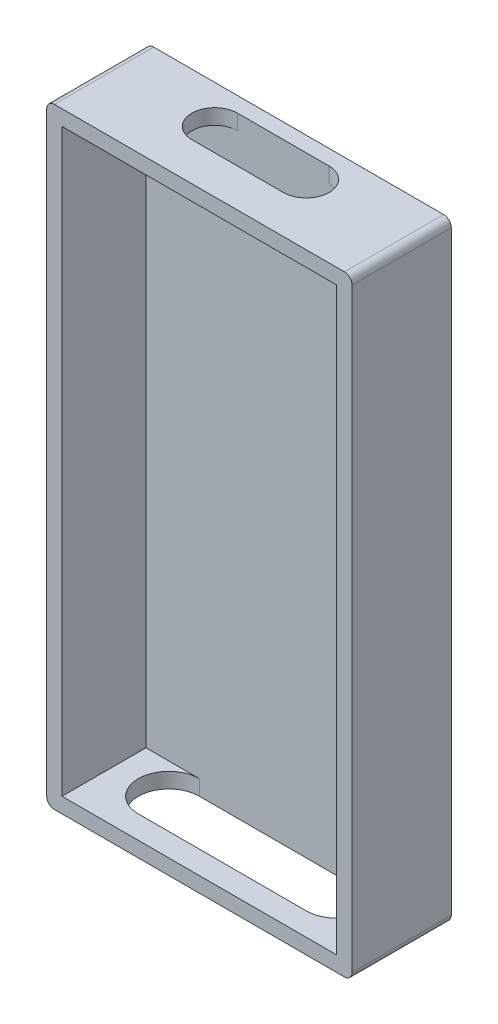
ISO-10303-21;
HEADER;
FILE_DESCRIPTION(('STEP AP214'),'2;1');
FILE_NAME('part.step','',(''),(''),'','','');
FILE_SCHEMA(('AUTOMOTIVE_DESIGN { 1 0 10303 214 1 1 1 1 }'));
ENDSEC;
DATA;
#1=APPLICATION_CONTEXT('core data for automotive mechanical design processes');
#2=APPLICATION_PROTOCOL_DEFINITION('international standard','automotive_design',2000,#1);
#3=PRODUCT_CONTEXT('',#1,'mechanical');
#4=PRODUCT('Part','Part','',(#3));
#5=PRODUCT_RELATED_PRODUCT_CATEGORY('part','',(#4));
#6=PRODUCT_DEFINITION_FORMATION('','',#4);
#7=PRODUCT_DEFINITION_CONTEXT('part definition',#1,'design');
#8=PRODUCT_DEFINITION('design','',#6,#7);
#9=PRODUCT_DEFINITION_SHAPE('','',#8);
#10=(LENGTH_UNIT() NAMED_UNIT(*) SI_UNIT(.MILLI.,.METRE.));
#11=(NAMED_UNIT(*) PLANE_ANGLE_UNIT() SI_UNIT($,.RADIAN.));
#12=(NAMED_UNIT(*) SI_UNIT($,.STERADIAN.) SOLID_ANGLE_UNIT());
#13=UNCERTAINTY_MEASURE_WITH_UNIT(LENGTH_MEASURE(1.E-05),#10,'distance_accuracy_value','');
#14=(GEOMETRIC_REPRESENTATION_CONTEXT(3) GLOBAL_UNCERTAINTY_ASSIGNED_CONTEXT((#13)) GLOBAL_UNIT_ASSIGNED_CONTEXT((#10,
#11,#12)) REPRESENTATION_CONTEXT('',''));
#15=CARTESIAN_POINT('',(0.,0.,0.));
#16=DIRECTION('',(0.,0.,1.));
#17=DIRECTION('',(1.,0.,0.));
#18=AXIS2_PLACEMENT_3D('',#15,#16,#17);
#19=CARTESIAN_POINT('',(10.,-20.,6.5));
#20=DIRECTION('',(-1.,0.,0.));
#21=DIRECTION('',(0.,0.,1.));
#22=AXIS2_PLACEMENT_3D('',#19,#20,#21);
#23=PLANE('',#22);
#24=DIRECTION('',(0.,1.,0.));
#25=VECTOR('',#24,1.);
#26=CARTESIAN_POINT('',(10.,-20.,0.));
#27=LINE('',#26,#25);
#28=CARTESIAN_POINT('',(10.,-19.5,0.));
#29=VERTEX_POINT('',#28);
#30=CARTESIAN_POINT('',(10.,19.5,0.));
#31=VERTEX_POINT('',#30);
#32=EDGE_CURVE('E279',#29,#31,#27,.T.);
#33=ORIENTED_EDGE('',*,*,#32,.T.);
#34=DIRECTION('',(0.,0.,-1.));
#35=VECTOR('',#34,1.);
#36=CARTESIAN_POINT('',(10.,19.5,6.5));
#37=LINE('',#36,#35);
#38=CARTESIAN_POINT('',(10.,19.5,6.5));
#39=VERTEX_POINT('',#38);
#40=EDGE_CURVE('E316',#31,#39,#37,.F.);
#41=ORIENTED_EDGE('',*,*,#40,.T.);
#42=DIRECTION('',(0.,1.,0.));
#43=VECTOR('',#42,1.);
#44=CARTESIAN_POINT('',(10.,-20.,6.5));
#45=LINE('',#44,#43);
#46=CARTESIAN_POINT('',(10.,-19.5,6.5));
#47=VERTEX_POINT('',#46);
#48=EDGE_CURVE('E280',#47,#39,#45,.T.);
#49=ORIENTED_EDGE('',*,*,#48,.F.);
#50=DIRECTION('',(0.,0.,-1.));
#51=VECTOR('',#50,1.);
#52=CARTESIAN_POINT('',(10.,-19.5,6.5));
#53=LINE('',#52,#51);
#54=EDGE_CURVE('E313',#47,#29,#53,.T.);
#55=ORIENTED_EDGE('',*,*,#54,.T.);
#56=EDGE_LOOP('',(#33,#41,#49,#55));
#57=FACE_BOUND('',#56,.T.);
#58=ADVANCED_FACE('F43',(#57),#23,.F.);
#59=CARTESIAN_POINT('',(-10.,20.,6.5));
#60=DIRECTION('',(0.,-1.,0.));
#61=DIRECTION('',(0.,0.,-1.));
#62=AXIS2_PLACEMENT_3D('',#59,#60,#61);
#63=PLANE('',#62);
#64=DIRECTION('',(1.,0.,0.));
#65=VECTOR('',#64,1.);
#66=CARTESIAN_POINT('',(-3.,20.,4.));
#67=LINE('',#66,#65);
#68=CARTESIAN_POINT('',(-3.,20.,4.));
#69=VERTEX_POINT('',#68);
#70=CARTESIAN_POINT('',(3.,20.,4.));
#71=VERTEX_POINT('',#70);
#72=EDGE_CURVE('E196',#69,#71,#67,.T.);
#73=ORIENTED_EDGE('',*,*,#72,.F.);
#74=CARTESIAN_POINT('',(-3.,20.,2.5));
#75=DIRECTION('',(0.,1.,0.));
#76=DIRECTION('',(0.,0.,1.));
#77=AXIS2_PLACEMENT_3D('',#74,#75,#76);
#78=CIRCLE('',#77,1.5);
#79=CARTESIAN_POINT('',(-3.,20.,0.999999999999998));
#80=VERTEX_POINT('',#79);
#81=EDGE_CURVE('E201',#80,#69,#78,.T.);
#82=ORIENTED_EDGE('',*,*,#81,.F.);
#83=DIRECTION('',(-1.,0.,0.));
#84=VECTOR('',#83,1.);
#85=CARTESIAN_POINT('',(-3.,20.,0.999999999999998));
#86=LINE('',#85,#84);
#87=CARTESIAN_POINT('',(3.,20.,0.999999999999997));
#88=VERTEX_POINT('',#87);
#89=EDGE_CURVE('E206',#88,#80,#86,.T.);
#90=ORIENTED_EDGE('',*,*,#89,.F.);
#91=CARTESIAN_POINT('',(3.,20.,2.5));
#92=DIRECTION('',(0.,1.,0.));
#93=DIRECTION('',(0.,0.,1.));
#94=AXIS2_PLACEMENT_3D('',#91,#92,#93);
#95=CIRCLE('',#94,1.5);
#96=EDGE_CURVE('E185',#71,#88,#95,.T.);
#97=ORIENTED_EDGE('',*,*,#96,.F.);
#98=EDGE_LOOP('',(#73,#82,#90,#97));
#99=FACE_BOUND('',#98,.T.);
#100=DIRECTION('',(-1.,0.,0.));
#101=VECTOR('',#100,1.);
#102=CARTESIAN_POINT('',(-10.,20.,6.5));
#103=LINE('',#102,#101);
#104=CARTESIAN_POINT('',(9.5,20.,6.5));
#105=VERTEX_POINT('',#104);
#106=CARTESIAN_POINT('',(-9.5,20.,6.5));
#107=VERTEX_POINT('',#106);
#108=EDGE_CURVE('E283',#105,#107,#103,.T.);
#109=ORIENTED_EDGE('',*,*,#108,.F.);
#110=DIRECTION('',(0.,0.,-1.));
#111=VECTOR('',#110,1.);
#112=CARTESIAN_POINT('',(9.5,20.,6.5));
#113=LINE('',#112,#111);
#114=CARTESIAN_POINT('',(9.5,20.,0.));
#115=VERTEX_POINT('',#114);
#116=EDGE_CURVE('E302',#105,#115,#113,.T.);
#117=ORIENTED_EDGE('',*,*,#116,.T.);
#118=DIRECTION('',(-1.,0.,0.));
#119=VECTOR('',#118,1.);
#120=CARTESIAN_POINT('',(-10.,20.,0.));
#121=LINE('',#120,#119);
#122=CARTESIAN_POINT('',(-9.5,20.,0.));
#123=VERTEX_POINT('',#122);
#124=EDGE_CURVE('E294',#115,#123,#121,.T.);
#125=ORIENTED_EDGE('',*,*,#124,.T.);
#126=DIRECTION('',(0.,0.,-1.));
#127=VECTOR('',#126,1.);
#128=CARTESIAN_POINT('',(-9.5,20.,6.5));
#129=LINE('',#128,#127);
#130=EDGE_CURVE('E291',#123,#107,#129,.F.);
#131=ORIENTED_EDGE('',*,*,#130,.T.);
#132=EDGE_LOOP('',(#109,#117,#125,#131));
#133=FACE_BOUND('',#132,.T.);
#134=ADVANCED_FACE('F203',(#99,#133),#63,.F.);
#135=CARTESIAN_POINT('',(-10.,-20.,6.5));
#136=DIRECTION('',(1.,0.,0.));
#137=DIRECTION('',(0.,0.,-1.));
#138=AXIS2_PLACEMENT_3D('',#135,#136,#137);
#139=PLANE('',#138);
#140=DIRECTION('',(0.,-1.,0.));
#141=VECTOR('',#140,1.);
#142=CARTESIAN_POINT('',(-10.,-20.,6.5));
#143=LINE('',#142,#141);
#144=CARTESIAN_POINT('',(-10.,19.5,6.5));
#145=VERTEX_POINT('',#144);
#146=CARTESIAN_POINT('',(-10.,-19.5,6.5));
#147=VERTEX_POINT('',#146);
#148=EDGE_CURVE('E287',#145,#147,#143,.T.);
#149=ORIENTED_EDGE('',*,*,#148,.F.);
#150=DIRECTION('',(0.,0.,-1.));
#151=VECTOR('',#150,1.);
#152=CARTESIAN_POINT('',(-10.,19.5,6.5));
#153=LINE('',#152,#151);
#154=CARTESIAN_POINT('',(-10.,19.5,0.));
#155=VERTEX_POINT('',#154);
#156=EDGE_CURVE('E327',#145,#155,#153,.T.);
#157=ORIENTED_EDGE('',*,*,#156,.T.);
#158=DIRECTION('',(0.,-1.,0.));
#159=VECTOR('',#158,1.);
#160=CARTESIAN_POINT('',(-10.,-20.,0.));
#161=LINE('',#160,#159);
#162=CARTESIAN_POINT('',(-10.,-19.5,0.));
#163=VERTEX_POINT('',#162);
#164=EDGE_CURVE('E297',#155,#163,#161,.T.);
#165=ORIENTED_EDGE('',*,*,#164,.T.);
#166=DIRECTION('',(0.,0.,-1.));
#167=VECTOR('',#166,1.);
#168=CARTESIAN_POINT('',(-10.,-19.5,6.5));
#169=LINE('',#168,#167);
#170=EDGE_CURVE('E325',#163,#147,#169,.F.);
#171=ORIENTED_EDGE('',*,*,#170,.T.);
#172=EDGE_LOOP('',(#149,#157,#165,#171));
#173=FACE_BOUND('',#172,.T.);
#174=ADVANCED_FACE('F333',(#173),#139,.F.);
#175=CARTESIAN_POINT('',(-10.,-20.,6.5));
#176=DIRECTION('',(0.,1.,0.));
#177=DIRECTION('',(0.,0.,1.));
#178=AXIS2_PLACEMENT_3D('',#175,#176,#177);
#179=PLANE('',#178);
#180=DIRECTION('',(1.,0.,0.));
#181=VECTOR('',#180,1.);
#182=CARTESIAN_POINT('',(-5.5,-20.,0.999999999999999));
#183=LINE('',#182,#181);
#184=CARTESIAN_POINT('',(-5.5,-20.,0.999999999999999));
#185=VERTEX_POINT('',#184);
#186=CARTESIAN_POINT('',(5.5,-20.,1.));
#187=VERTEX_POINT('',#186);
#188=EDGE_CURVE('E229',#185,#187,#183,.T.);
#189=ORIENTED_EDGE('',*,*,#188,.F.);
#190=CARTESIAN_POINT('',(-5.5,-20.,3.));
#191=DIRECTION('',(0.,-1.,0.));
#192=DIRECTION('',(0.,0.,-1.));
#193=AXIS2_PLACEMENT_3D('',#190,#191,#192);
#194=CIRCLE('',#193,2.);
#195=CARTESIAN_POINT('',(-5.5,-20.,5.));
#196=VERTEX_POINT('',#195);
#197=EDGE_CURVE('E217',#196,#185,#194,.T.);
#198=ORIENTED_EDGE('',*,*,#197,.F.);
#199=DIRECTION('',(-1.,0.,0.));
#200=VECTOR('',#199,1.);
#201=CARTESIAN_POINT('',(-5.5,-20.,5.));
#202=LINE('',#201,#200);
#203=CARTESIAN_POINT('',(5.5,-20.,5.));
#204=VERTEX_POINT('',#203);
#205=EDGE_CURVE('E235',#204,#196,#202,.T.);
#206=ORIENTED_EDGE('',*,*,#205,.F.);
#207=CARTESIAN_POINT('',(5.5,-20.,3.));
#208=DIRECTION('',(0.,-1.,0.));
#209=DIRECTION('',(0.,0.,-1.));
#210=AXIS2_PLACEMENT_3D('',#207,#208,#209);
#211=CIRCLE('',#210,2.);
#212=EDGE_CURVE('E232',#187,#204,#211,.T.);
#213=ORIENTED_EDGE('',*,*,#212,.F.);
#214=EDGE_LOOP('',(#189,#198,#206,#213));
#215=FACE_BOUND('',#214,.T.);
#216=DIRECTION('',(1.,0.,0.));
#217=VECTOR('',#216,1.);
#218=CARTESIAN_POINT('',(-10.,-20.,6.5));
#219=LINE('',#218,#217);
#220=CARTESIAN_POINT('',(-9.5,-20.,6.5));
#221=VERTEX_POINT('',#220);
#222=CARTESIAN_POINT('',(9.5,-20.,6.5));
#223=VERTEX_POINT('',#222);
#224=EDGE_CURVE('E289',#221,#223,#219,.T.);
#225=ORIENTED_EDGE('',*,*,#224,.F.);
#226=DIRECTION('',(0.,0.,-1.));
#227=VECTOR('',#226,1.);
#228=CARTESIAN_POINT('',(-9.5,-20.,6.5));
#229=LINE('',#228,#227);
#230=CARTESIAN_POINT('',(-9.5,-20.,0.));
#231=VERTEX_POINT('',#230);
#232=EDGE_CURVE('E12',#221,#231,#229,.T.);
#233=ORIENTED_EDGE('',*,*,#232,.T.);
#234=DIRECTION('',(1.,0.,0.));
#235=VECTOR('',#234,1.);
#236=CARTESIAN_POINT('',(-10.,-20.,0.));
#237=LINE('',#236,#235);
#238=CARTESIAN_POINT('',(9.5,-20.,0.));
#239=VERTEX_POINT('',#238);
#240=EDGE_CURVE('E284',#231,#239,#237,.T.);
#241=ORIENTED_EDGE('',*,*,#240,.T.);
#242=DIRECTION('',(0.,0.,-1.));
#243=VECTOR('',#242,1.);
#244=CARTESIAN_POINT('',(9.5,-20.,6.5));
#245=LINE('',#244,#243);
#246=EDGE_CURVE('E51',#239,#223,#245,.F.);
#247=ORIENTED_EDGE('',*,*,#246,.T.);
#248=EDGE_LOOP('',(#225,#233,#241,#247));
#249=FACE_BOUND('',#248,.T.);
#250=ADVANCED_FACE('F344',(#215,#249),#179,.F.);
#251=CARTESIAN_POINT('',(0.,0.,6.5));
#252=DIRECTION('',(0.,0.,-1.));
#253=DIRECTION('',(-1.,0.,0.));
#254=AXIS2_PLACEMENT_3D('',#251,#252,#253);
#255=PLANE('',#254);
#256=DIRECTION('',(0.,1.,0.));
#257=VECTOR('',#256,1.);
#258=CARTESIAN_POINT('',(8.99711468655567,19.,6.5));
#259=LINE('',#258,#257);
#260=CARTESIAN_POINT('',(8.99711468655568,-19.,6.5));
#261=VERTEX_POINT('',#260);
#262=CARTESIAN_POINT('',(8.99711468655567,19.,6.5));
#263=VERTEX_POINT('',#262);
#264=EDGE_CURVE('E249',#261,#263,#259,.T.);
#265=ORIENTED_EDGE('',*,*,#264,.F.);
#266=DIRECTION('',(1.,0.,0.));
#267=VECTOR('',#266,1.);
#268=CARTESIAN_POINT('',(-8.99999999999999,-19.,6.5));
#269=LINE('',#268,#267);
#270=CARTESIAN_POINT('',(-8.99999999999999,-19.,6.5));
#271=VERTEX_POINT('',#270);
#272=EDGE_CURVE('E252',#271,#261,#269,.T.);
#273=ORIENTED_EDGE('',*,*,#272,.F.);
#274=DIRECTION('',(0.,-1.,0.));
#275=VECTOR('',#274,1.);
#276=CARTESIAN_POINT('',(-9.,19.,6.5));
#277=LINE('',#276,#275);
#278=CARTESIAN_POINT('',(-9.,19.,6.5));
#279=VERTEX_POINT('',#278);
#280=EDGE_CURVE('E227',#279,#271,#277,.T.);
#281=ORIENTED_EDGE('',*,*,#280,.F.);
#282=DIRECTION('',(-1.,0.,0.));
#283=VECTOR('',#282,1.);
#284=CARTESIAN_POINT('',(-9.,19.,6.5));
#285=LINE('',#284,#283);
#286=EDGE_CURVE('E246',#263,#279,#285,.T.);
#287=ORIENTED_EDGE('',*,*,#286,.F.);
#288=EDGE_LOOP('',(#265,#273,#281,#287));
#289=FACE_BOUND('',#288,.T.);
#290=ORIENTED_EDGE('',*,*,#48,.T.);
#291=CARTESIAN_POINT('',(9.5,19.5,6.5));
#292=DIRECTION('',(0.,0.,-1.));
#293=DIRECTION('',(-1.,0.,0.));
#294=AXIS2_PLACEMENT_3D('',#291,#292,#293);
#295=CIRCLE('',#294,0.5);
#296=EDGE_CURVE('E323',#39,#105,#295,.F.);
#297=ORIENTED_EDGE('',*,*,#296,.T.);
#298=ORIENTED_EDGE('',*,*,#108,.T.);
#299=CARTESIAN_POINT('',(-9.5,19.5,6.5));
#300=DIRECTION('',(0.,0.,-1.));
#301=DIRECTION('',(-1.,0.,0.));
#302=AXIS2_PLACEMENT_3D('',#299,#300,#301);
#303=CIRCLE('',#302,0.5);
#304=EDGE_CURVE('E321',#107,#145,#303,.F.);
#305=ORIENTED_EDGE('',*,*,#304,.T.);
#306=ORIENTED_EDGE('',*,*,#148,.T.);
#307=CARTESIAN_POINT('',(-9.5,-19.5,6.5));
#308=DIRECTION('',(0.,0.,-1.));
#309=DIRECTION('',(-1.,0.,0.));
#310=AXIS2_PLACEMENT_3D('',#307,#308,#309);
#311=CIRCLE('',#310,0.5);
#312=EDGE_CURVE('E64',#147,#221,#311,.F.);
#313=ORIENTED_EDGE('',*,*,#312,.T.);
#314=ORIENTED_EDGE('',*,*,#224,.T.);
#315=CARTESIAN_POINT('',(9.5,-19.5,6.5));
#316=DIRECTION('',(0.,0.,-1.));
#317=DIRECTION('',(-1.,0.,0.));
#318=AXIS2_PLACEMENT_3D('',#315,#316,#317);
#319=CIRCLE('',#318,0.5);
#320=EDGE_CURVE('E318',#223,#47,#319,.F.);
#321=ORIENTED_EDGE('',*,*,#320,.T.);
#322=EDGE_LOOP('',(#290,#297,#298,#305,#306,#313,#314,#321));
#323=FACE_BOUND('',#322,.T.);
#324=ADVANCED_FACE('F346',(#289,#323),#255,.F.);
#325=CARTESIAN_POINT('',(0.,0.,0.));
#326=DIRECTION('',(0.,0.,-1.));
#327=DIRECTION('',(-1.,0.,0.));
#328=AXIS2_PLACEMENT_3D('',#325,#326,#327);
#329=PLANE('',#328);
#330=ORIENTED_EDGE('',*,*,#124,.F.);
#331=CARTESIAN_POINT('',(9.5,19.5,0.));
#332=DIRECTION('',(0.,0.,-1.));
#333=DIRECTION('',(-1.,0.,0.));
#334=AXIS2_PLACEMENT_3D('',#331,#332,#333);
#335=CIRCLE('',#334,0.5);
#336=EDGE_CURVE('E311',#115,#31,#335,.T.);
#337=ORIENTED_EDGE('',*,*,#336,.T.);
#338=ORIENTED_EDGE('',*,*,#32,.F.);
#339=CARTESIAN_POINT('',(9.5,-19.5,0.));
#340=DIRECTION('',(0.,0.,-1.));
#341=DIRECTION('',(-1.,0.,0.));
#342=AXIS2_PLACEMENT_3D('',#339,#340,#341);
#343=CIRCLE('',#342,0.5);
#344=EDGE_CURVE('E305',#29,#239,#343,.T.);
#345=ORIENTED_EDGE('',*,*,#344,.T.);
#346=ORIENTED_EDGE('',*,*,#240,.F.);
#347=CARTESIAN_POINT('',(-9.5,-19.5,0.));
#348=DIRECTION('',(0.,0.,-1.));
#349=DIRECTION('',(-1.,0.,0.));
#350=AXIS2_PLACEMENT_3D('',#347,#348,#349);
#351=CIRCLE('',#350,0.5);
#352=EDGE_CURVE('E307',#231,#163,#351,.T.);
#353=ORIENTED_EDGE('',*,*,#352,.T.);
#354=ORIENTED_EDGE('',*,*,#164,.F.);
#355=CARTESIAN_POINT('',(-9.5,19.5,0.));
#356=DIRECTION('',(0.,0.,-1.));
#357=DIRECTION('',(-1.,0.,0.));
#358=AXIS2_PLACEMENT_3D('',#355,#356,#357);
#359=CIRCLE('',#358,0.5);
#360=EDGE_CURVE('E309',#155,#123,#359,.T.);
#361=ORIENTED_EDGE('',*,*,#360,.T.);
#362=EDGE_LOOP('',(#330,#337,#338,#345,#346,#353,#354,#361));
#363=FACE_BOUND('',#362,.T.);
#364=ADVANCED_FACE('F339',(#363),#329,.T.);
#365=CARTESIAN_POINT('',(0.,0.,1.));
#366=DIRECTION('',(0.,0.,-1.));
#367=DIRECTION('',(-1.,0.,0.));
#368=AXIS2_PLACEMENT_3D('',#365,#366,#367);
#369=PLANE('',#368);
#370=DIRECTION('',(0.,-1.,0.));
#371=VECTOR('',#370,1.);
#372=CARTESIAN_POINT('',(-9.,19.,1.));
#373=LINE('',#372,#371);
#374=CARTESIAN_POINT('',(-9.,19.,1.));
#375=VERTEX_POINT('',#374);
#376=CARTESIAN_POINT('',(-8.99999999999999,-19.,1.));
#377=VERTEX_POINT('',#376);
#378=EDGE_CURVE('E261',#375,#377,#373,.T.);
#379=ORIENTED_EDGE('',*,*,#378,.T.);
#380=DIRECTION('',(1.,0.,0.));
#381=VECTOR('',#380,1.);
#382=CARTESIAN_POINT('',(-8.99999999999999,-19.,1.));
#383=LINE('',#382,#381);
#384=CARTESIAN_POINT('',(-5.5,-19.,0.999999999999999));
#385=VERTEX_POINT('',#384);
#386=EDGE_CURVE('E257',#377,#385,#383,.T.);
#387=ORIENTED_EDGE('',*,*,#386,.T.);
#388=DIRECTION('',(0.,-1.,0.));
#389=VECTOR('',#388,1.);
#390=CARTESIAN_POINT('',(-5.5,-3.47582530373998,0.999999999999999));
#391=LINE('',#390,#389);
#392=EDGE_CURVE('E238',#385,#185,#391,.T.);
#393=ORIENTED_EDGE('',*,*,#392,.T.);
#394=ORIENTED_EDGE('',*,*,#188,.T.);
#395=DIRECTION('',(0.,-1.,0.));
#396=VECTOR('',#395,1.);
#397=CARTESIAN_POINT('',(5.5,-3.47582530373998,1.));
#398=LINE('',#397,#396);
#399=CARTESIAN_POINT('',(5.5,-19.,1.));
#400=VERTEX_POINT('',#399);
#401=EDGE_CURVE('E242',#400,#187,#398,.T.);
#402=ORIENTED_EDGE('',*,*,#401,.F.);
#403=CARTESIAN_POINT('',(8.99711468655568,-19.,1.));
#404=VERTEX_POINT('',#403);
#405=EDGE_CURVE('E248',#400,#404,#383,.T.);
#406=ORIENTED_EDGE('',*,*,#405,.T.);
#407=DIRECTION('',(0.,1.,0.));
#408=VECTOR('',#407,1.);
#409=CARTESIAN_POINT('',(8.99711468655567,19.,1.));
#410=LINE('',#409,#408);
#411=CARTESIAN_POINT('',(8.99711468655567,19.,1.));
#412=VERTEX_POINT('',#411);
#413=EDGE_CURVE('E270',#404,#412,#410,.T.);
#414=ORIENTED_EDGE('',*,*,#413,.T.);
#415=DIRECTION('',(-1.,0.,0.));
#416=VECTOR('',#415,1.);
#417=CARTESIAN_POINT('',(-9.,19.,1.));
#418=LINE('',#417,#416);
#419=CARTESIAN_POINT('',(3.,19.,0.999999999999999));
#420=VERTEX_POINT('',#419);
#421=EDGE_CURVE('E266',#412,#420,#418,.T.);
#422=ORIENTED_EDGE('',*,*,#421,.T.);
#423=DIRECTION('',(0.,1.,0.));
#424=VECTOR('',#423,1.);
#425=CARTESIAN_POINT('',(3.,9.51316701949486,0.999999999999997));
#426=LINE('',#425,#424);
#427=EDGE_CURVE('E191',#420,#88,#426,.T.);
#428=ORIENTED_EDGE('',*,*,#427,.T.);
#429=ORIENTED_EDGE('',*,*,#89,.T.);
#430=DIRECTION('',(0.,1.,0.));
#431=VECTOR('',#430,1.);
#432=CARTESIAN_POINT('',(-3.,9.51316701949486,0.999999999999998));
#433=LINE('',#432,#431);
#434=CARTESIAN_POINT('',(-3.,19.,0.999999999999998));
#435=VERTEX_POINT('',#434);
#436=EDGE_CURVE('E211',#435,#80,#433,.T.);
#437=ORIENTED_EDGE('',*,*,#436,.F.);
#438=EDGE_CURVE('E269',#435,#375,#418,.T.);
#439=ORIENTED_EDGE('',*,*,#438,.T.);
#440=EDGE_LOOP('',(#379,#387,#393,#394,#402,#406,#414,#422,#428,#429,#437,#439));
#441=FACE_BOUND('',#440,.T.);
#442=ADVANCED_FACE('F382',(#441),#369,.F.);
#443=CARTESIAN_POINT('',(-8.99999999999999,-19.,-42.0463570008275));
#444=DIRECTION('',(0.,-1.,0.));
#445=DIRECTION('',(0.,0.,-1.));
#446=AXIS2_PLACEMENT_3D('',#443,#444,#445);
#447=PLANE('',#446);
#448=DIRECTION('',(1.,0.,0.));
#449=VECTOR('',#448,1.);
#450=CARTESIAN_POINT('',(-5.5,-19.,5.));
#451=LINE('',#450,#449);
#452=CARTESIAN_POINT('',(-5.5,-19.,5.));
#453=VERTEX_POINT('',#452);
#454=CARTESIAN_POINT('',(5.5,-19.,5.));
#455=VERTEX_POINT('',#454);
#456=EDGE_CURVE('E222',#453,#455,#451,.T.);
#457=ORIENTED_EDGE('',*,*,#456,.F.);
#458=CARTESIAN_POINT('',(-5.5,-19.,3.));
#459=DIRECTION('',(0.,-1.,0.));
#460=DIRECTION('',(0.,0.,-1.));
#461=AXIS2_PLACEMENT_3D('',#458,#459,#460);
#462=CIRCLE('',#461,2.);
#463=EDGE_CURVE('E225',#385,#453,#462,.F.);
#464=ORIENTED_EDGE('',*,*,#463,.F.);
#465=ORIENTED_EDGE('',*,*,#386,.F.);
#466=DIRECTION('',(0.,0.,1.));
#467=VECTOR('',#466,1.);
#468=CARTESIAN_POINT('',(-8.99999999999999,-19.,-42.0463570008275));
#469=LINE('',#468,#467);
#470=EDGE_CURVE('E264',#377,#271,#469,.T.);
#471=ORIENTED_EDGE('',*,*,#470,.T.);
#472=ORIENTED_EDGE('',*,*,#272,.T.);
#473=DIRECTION('',(0.,0.,1.));
#474=VECTOR('',#473,1.);
#475=CARTESIAN_POINT('',(8.99711468655568,-19.,-42.0463570008275));
#476=LINE('',#475,#474);
#477=EDGE_CURVE('E260',#404,#261,#476,.T.);
#478=ORIENTED_EDGE('',*,*,#477,.F.);
#479=ORIENTED_EDGE('',*,*,#405,.F.);
#480=CARTESIAN_POINT('',(5.5,-19.,3.));
#481=DIRECTION('',(0.,-1.,0.));
#482=DIRECTION('',(0.,0.,-1.));
#483=AXIS2_PLACEMENT_3D('',#480,#481,#482);
#484=CIRCLE('',#483,2.);
#485=EDGE_CURVE('E219',#455,#400,#484,.F.);
#486=ORIENTED_EDGE('',*,*,#485,.F.);
#487=EDGE_LOOP('',(#457,#464,#465,#471,#472,#478,#479,#486));
#488=FACE_BOUND('',#487,.T.);
#489=ADVANCED_FACE('F388',(#488),#447,.F.);
#490=CARTESIAN_POINT('',(8.99711468655567,19.,-42.0463570008275));
#491=DIRECTION('',(1.,0.,0.));
#492=DIRECTION('',(0.,1.,0.));
#493=AXIS2_PLACEMENT_3D('',#490,#491,#492);
#494=PLANE('',#493);
#495=ORIENTED_EDGE('',*,*,#477,.T.);
#496=ORIENTED_EDGE('',*,*,#264,.T.);
#497=DIRECTION('',(0.,0.,1.));
#498=VECTOR('',#497,1.);
#499=CARTESIAN_POINT('',(8.99711468655567,19.,-42.0463570008275));
#500=LINE('',#499,#498);
#501=EDGE_CURVE('E273',#412,#263,#500,.T.);
#502=ORIENTED_EDGE('',*,*,#501,.F.);
#503=ORIENTED_EDGE('',*,*,#413,.F.);
#504=EDGE_LOOP('',(#495,#496,#502,#503));
#505=FACE_BOUND('',#504,.T.);
#506=ADVANCED_FACE('F392',(#505),#494,.F.);
#507=CARTESIAN_POINT('',(-9.,19.,-42.0463570008275));
#508=DIRECTION('',(0.,1.,0.));
#509=DIRECTION('',(0.,0.,1.));
#510=AXIS2_PLACEMENT_3D('',#507,#508,#509);
#511=PLANE('',#510);
#512=ORIENTED_EDGE('',*,*,#438,.F.);
#513=CARTESIAN_POINT('',(-3.,19.,2.5));
#514=DIRECTION('',(0.,1.,0.));
#515=DIRECTION('',(0.,0.,1.));
#516=AXIS2_PLACEMENT_3D('',#513,#514,#515);
#517=CIRCLE('',#516,1.5);
#518=CARTESIAN_POINT('',(-3.,19.,4.));
#519=VERTEX_POINT('',#518);
#520=EDGE_CURVE('E218',#519,#435,#517,.F.);
#521=ORIENTED_EDGE('',*,*,#520,.F.);
#522=DIRECTION('',(-1.,0.,0.));
#523=VECTOR('',#522,1.);
#524=CARTESIAN_POINT('',(-3.,19.,4.));
#525=LINE('',#524,#523);
#526=CARTESIAN_POINT('',(3.,19.,3.99999999999999));
#527=VERTEX_POINT('',#526);
#528=EDGE_CURVE('E215',#527,#519,#525,.T.);
#529=ORIENTED_EDGE('',*,*,#528,.F.);
#530=CARTESIAN_POINT('',(3.,19.,2.5));
#531=DIRECTION('',(0.,1.,0.));
#532=DIRECTION('',(0.,0.,1.));
#533=AXIS2_PLACEMENT_3D('',#530,#531,#532);
#534=CIRCLE('',#533,1.5);
#535=EDGE_CURVE('E188',#420,#527,#534,.F.);
#536=ORIENTED_EDGE('',*,*,#535,.F.);
#537=ORIENTED_EDGE('',*,*,#421,.F.);
#538=ORIENTED_EDGE('',*,*,#501,.T.);
#539=ORIENTED_EDGE('',*,*,#286,.T.);
#540=DIRECTION('',(0.,0.,1.));
#541=VECTOR('',#540,1.);
#542=CARTESIAN_POINT('',(-9.,19.,-42.0463570008275));
#543=LINE('',#542,#541);
#544=EDGE_CURVE('E265',#375,#279,#543,.T.);
#545=ORIENTED_EDGE('',*,*,#544,.F.);
#546=EDGE_LOOP('',(#512,#521,#529,#536,#537,#538,#539,#545));
#547=FACE_BOUND('',#546,.T.);
#548=ADVANCED_FACE('F396',(#547),#511,.F.);
#549=CARTESIAN_POINT('',(-9.,19.,-42.0463570008275));
#550=DIRECTION('',(-1.,0.,0.));
#551=DIRECTION('',(0.,-1.,0.));
#552=AXIS2_PLACEMENT_3D('',#549,#550,#551);
#553=PLANE('',#552);
#554=ORIENTED_EDGE('',*,*,#544,.T.);
#555=ORIENTED_EDGE('',*,*,#280,.T.);
#556=ORIENTED_EDGE('',*,*,#470,.F.);
#557=ORIENTED_EDGE('',*,*,#378,.F.);
#558=EDGE_LOOP('',(#554,#555,#556,#557));
#559=FACE_BOUND('',#558,.T.);
#560=ADVANCED_FACE('F400',(#559),#553,.F.);
#561=CARTESIAN_POINT('',(-5.5,-3.47582530373998,3.));
#562=DIRECTION('',(0.,-1.,0.));
#563=DIRECTION('',(0.,0.,-1.));
#564=AXIS2_PLACEMENT_3D('',#561,#562,#563);
#565=CYLINDRICAL_SURFACE('',#564,2.);
#566=ORIENTED_EDGE('',*,*,#463,.T.);
#567=DIRECTION('',(0.,-1.,0.));
#568=VECTOR('',#567,1.);
#569=CARTESIAN_POINT('',(-5.5,-3.47582530373998,5.));
#570=LINE('',#569,#568);
#571=EDGE_CURVE('E223',#453,#196,#570,.T.);
#572=ORIENTED_EDGE('',*,*,#571,.T.);
#573=ORIENTED_EDGE('',*,*,#197,.T.);
#574=ORIENTED_EDGE('',*,*,#392,.F.);
#575=EDGE_LOOP('',(#566,#572,#573,#574));
#576=FACE_BOUND('',#575,.T.);
#577=ADVANCED_FACE('F404',(#576),#565,.F.);
#578=CARTESIAN_POINT('',(-5.5,-3.47582530373998,5.));
#579=DIRECTION('',(0.,0.,1.));
#580=DIRECTION('',(1.,0.,0.));
#581=AXIS2_PLACEMENT_3D('',#578,#579,#580);
#582=PLANE('',#581);
#583=ORIENTED_EDGE('',*,*,#456,.T.);
#584=DIRECTION('',(0.,-1.,0.));
#585=VECTOR('',#584,1.);
#586=CARTESIAN_POINT('',(5.5,-3.47582530373998,5.));
#587=LINE('',#586,#585);
#588=EDGE_CURVE('E240',#455,#204,#587,.T.);
#589=ORIENTED_EDGE('',*,*,#588,.T.);
#590=ORIENTED_EDGE('',*,*,#205,.T.);
#591=ORIENTED_EDGE('',*,*,#571,.F.);
#592=EDGE_LOOP('',(#583,#589,#590,#591));
#593=FACE_BOUND('',#592,.T.);
#594=ADVANCED_FACE('F408',(#593),#582,.F.);
#595=CARTESIAN_POINT('',(5.5,-3.47582530373998,3.));
#596=DIRECTION('',(0.,-1.,0.));
#597=DIRECTION('',(0.,0.,-1.));
#598=AXIS2_PLACEMENT_3D('',#595,#596,#597);
#599=CYLINDRICAL_SURFACE('',#598,2.);
#600=ORIENTED_EDGE('',*,*,#485,.T.);
#601=ORIENTED_EDGE('',*,*,#401,.T.);
#602=ORIENTED_EDGE('',*,*,#212,.T.);
#603=ORIENTED_EDGE('',*,*,#588,.F.);
#604=EDGE_LOOP('',(#600,#601,#602,#603));
#605=FACE_BOUND('',#604,.T.);
#606=ADVANCED_FACE('F410',(#605),#599,.F.);
#607=CARTESIAN_POINT('',(-3.,9.51316701949486,2.5));
#608=DIRECTION('',(0.,1.,0.));
#609=DIRECTION('',(0.,0.,1.));
#610=AXIS2_PLACEMENT_3D('',#607,#608,#609);
#611=CYLINDRICAL_SURFACE('',#610,1.5);
#612=ORIENTED_EDGE('',*,*,#520,.T.);
#613=ORIENTED_EDGE('',*,*,#436,.T.);
#614=ORIENTED_EDGE('',*,*,#81,.T.);
#615=DIRECTION('',(0.,1.,0.));
#616=VECTOR('',#615,1.);
#617=CARTESIAN_POINT('',(-3.,9.51316701949486,4.));
#618=LINE('',#617,#616);
#619=EDGE_CURVE('E192',#519,#69,#618,.T.);
#620=ORIENTED_EDGE('',*,*,#619,.F.);
#621=EDGE_LOOP('',(#612,#613,#614,#620));
#622=FACE_BOUND('',#621,.T.);
#623=ADVANCED_FACE('F413',(#622),#611,.F.);
#624=CARTESIAN_POINT('',(3.,9.51316701949486,2.5));
#625=DIRECTION('',(0.,1.,0.));
#626=DIRECTION('',(0.,0.,1.));
#627=AXIS2_PLACEMENT_3D('',#624,#625,#626);
#628=CYLINDRICAL_SURFACE('',#627,1.5);
#629=ORIENTED_EDGE('',*,*,#535,.T.);
#630=DIRECTION('',(0.,1.,0.));
#631=VECTOR('',#630,1.);
#632=CARTESIAN_POINT('',(3.,9.51316701949486,4.));
#633=LINE('',#632,#631);
#634=EDGE_CURVE('E181',#527,#71,#633,.T.);
#635=ORIENTED_EDGE('',*,*,#634,.T.);
#636=ORIENTED_EDGE('',*,*,#96,.T.);
#637=ORIENTED_EDGE('',*,*,#427,.F.);
#638=EDGE_LOOP('',(#629,#635,#636,#637));
#639=FACE_BOUND('',#638,.T.);
#640=ADVANCED_FACE('F183',(#639),#628,.F.);
#641=CARTESIAN_POINT('',(-3.,9.51316701949486,4.));
#642=DIRECTION('',(0.,0.,1.));
#643=DIRECTION('',(1.,0.,0.));
#644=AXIS2_PLACEMENT_3D('',#641,#642,#643);
#645=PLANE('',#644);
#646=ORIENTED_EDGE('',*,*,#528,.T.);
#647=ORIENTED_EDGE('',*,*,#619,.T.);
#648=ORIENTED_EDGE('',*,*,#72,.T.);
#649=ORIENTED_EDGE('',*,*,#634,.F.);
#650=EDGE_LOOP('',(#646,#647,#648,#649));
#651=FACE_BOUND('',#650,.T.);
#652=ADVANCED_FACE('F197',(#651),#645,.F.);
#653=CARTESIAN_POINT('',(9.5,19.5,6.5));
#654=DIRECTION('',(0.,0.,-1.));
#655=DIRECTION('',(-1.,0.,0.));
#656=AXIS2_PLACEMENT_3D('',#653,#654,#655);
#657=CYLINDRICAL_SURFACE('',#656,0.5);
#658=ORIENTED_EDGE('',*,*,#296,.F.);
#659=ORIENTED_EDGE('',*,*,#40,.F.);
#660=ORIENTED_EDGE('',*,*,#336,.F.);
#661=ORIENTED_EDGE('',*,*,#116,.F.);
#662=EDGE_LOOP('',(#658,#659,#660,#661));
#663=FACE_BOUND('',#662,.T.);
#664=ADVANCED_FACE('F356',(#663),#657,.T.);
#665=CARTESIAN_POINT('',(-9.5,19.5,6.5));
#666=DIRECTION('',(0.,0.,-1.));
#667=DIRECTION('',(-1.,0.,0.));
#668=AXIS2_PLACEMENT_3D('',#665,#666,#667);
#669=CYLINDRICAL_SURFACE('',#668,0.5);
#670=ORIENTED_EDGE('',*,*,#304,.F.);
#671=ORIENTED_EDGE('',*,*,#130,.F.);
#672=ORIENTED_EDGE('',*,*,#360,.F.);
#673=ORIENTED_EDGE('',*,*,#156,.F.);
#674=EDGE_LOOP('',(#670,#671,#672,#673));
#675=FACE_BOUND('',#674,.T.);
#676=ADVANCED_FACE('F359',(#675),#669,.T.);
#677=CARTESIAN_POINT('',(-9.5,-19.5,6.5));
#678=DIRECTION('',(0.,0.,-1.));
#679=DIRECTION('',(-1.,0.,0.));
#680=AXIS2_PLACEMENT_3D('',#677,#678,#679);
#681=CYLINDRICAL_SURFACE('',#680,0.5);
#682=ORIENTED_EDGE('',*,*,#312,.F.);
#683=ORIENTED_EDGE('',*,*,#170,.F.);
#684=ORIENTED_EDGE('',*,*,#352,.F.);
#685=ORIENTED_EDGE('',*,*,#232,.F.);
#686=EDGE_LOOP('',(#682,#683,#684,#685));
#687=FACE_BOUND('',#686,.T.);
#688=ADVANCED_FACE('F343',(#687),#681,.T.);
#689=CARTESIAN_POINT('',(9.5,-19.5,6.5));
#690=DIRECTION('',(0.,0.,-1.));
#691=DIRECTION('',(-1.,0.,0.));
#692=AXIS2_PLACEMENT_3D('',#689,#690,#691);
#693=CYLINDRICAL_SURFACE('',#692,0.5);
#694=ORIENTED_EDGE('',*,*,#320,.F.);
#695=ORIENTED_EDGE('',*,*,#246,.F.);
#696=ORIENTED_EDGE('',*,*,#344,.F.);
#697=ORIENTED_EDGE('',*,*,#54,.F.);
#698=EDGE_LOOP('',(#694,#695,#696,#697));
#699=FACE_BOUND('',#698,.T.);
#700=ADVANCED_FACE('F45',(#699),#693,.T.);
#701=CLOSED_SHELL('',(#58,#134,#174,#250,#324,#364,#442,#489,#506,#548,#560,#577,#594,#606,#623,
#640,#652,#664,#676,#688,#700));
#702=MANIFOLD_SOLID_BREP('B2',#701);
#703=ADVANCED_BREP_SHAPE_REPRESENTATION('',(#18,#702),#14);
#704=SHAPE_DEFINITION_REPRESENTATION(#9,#703);
ENDSEC;
END-ISO-10303-21;
